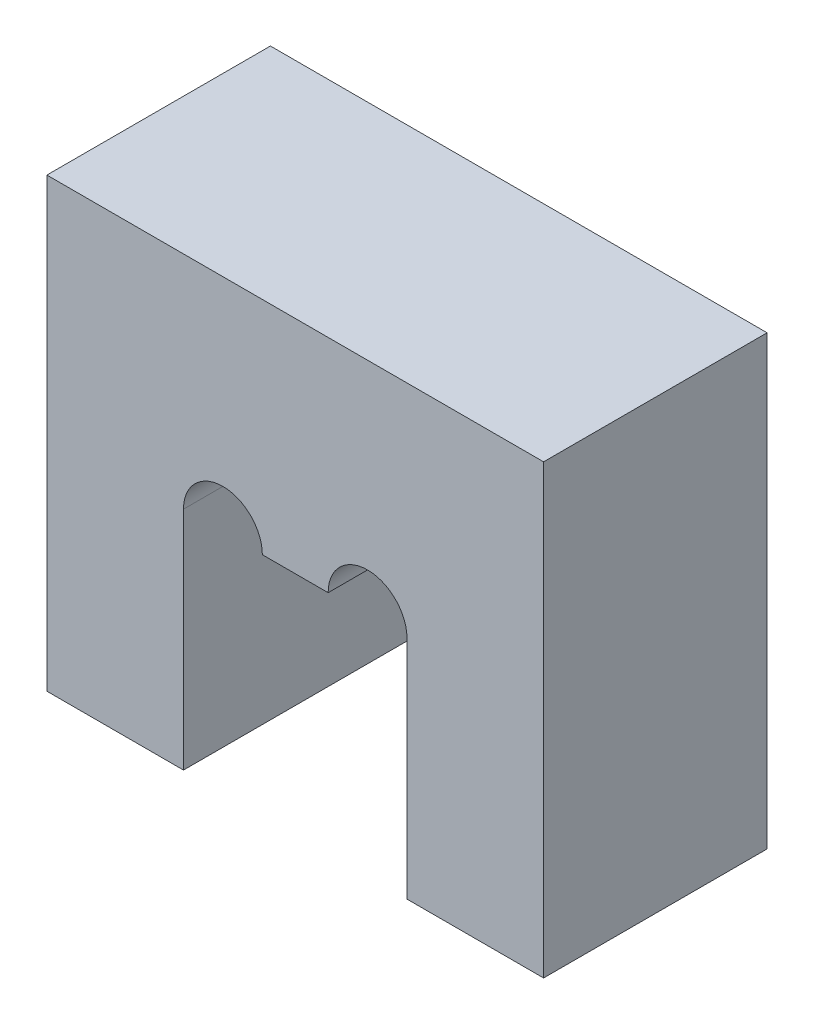
ISO-10303-21;
HEADER;
FILE_DESCRIPTION(('STEP AP214'),'2;1');
FILE_NAME('part.step','',(''),(''),'','','');
FILE_SCHEMA(('AUTOMOTIVE_DESIGN { 1 0 10303 214 1 1 1 1 }'));
ENDSEC;
DATA;
#1=APPLICATION_CONTEXT('core data for automotive mechanical design processes');
#2=APPLICATION_PROTOCOL_DEFINITION('international standard','automotive_design',2000,#1);
#3=PRODUCT_CONTEXT('',#1,'mechanical');
#4=PRODUCT('Part','Part','',(#3));
#5=PRODUCT_RELATED_PRODUCT_CATEGORY('part','',(#4));
#6=PRODUCT_DEFINITION_FORMATION('','',#4);
#7=PRODUCT_DEFINITION_CONTEXT('part definition',#1,'design');
#8=PRODUCT_DEFINITION('design','',#6,#7);
#9=PRODUCT_DEFINITION_SHAPE('','',#8);
#10=(LENGTH_UNIT() NAMED_UNIT(*) SI_UNIT(.MILLI.,.METRE.));
#11=(NAMED_UNIT(*) PLANE_ANGLE_UNIT() SI_UNIT($,.RADIAN.));
#12=(NAMED_UNIT(*) SI_UNIT($,.STERADIAN.) SOLID_ANGLE_UNIT());
#13=UNCERTAINTY_MEASURE_WITH_UNIT(LENGTH_MEASURE(1.E-05),#10,'distance_accuracy_value','');
#14=(GEOMETRIC_REPRESENTATION_CONTEXT(3) GLOBAL_UNCERTAINTY_ASSIGNED_CONTEXT((#13)) GLOBAL_UNIT_ASSIGNED_CONTEXT((#10,
#11,#12)) REPRESENTATION_CONTEXT('',''));
#15=CARTESIAN_POINT('',(0.,0.,0.));
#16=DIRECTION('',(0.,0.,1.));
#17=DIRECTION('',(1.,0.,0.));
#18=AXIS2_PLACEMENT_3D('',#15,#16,#17);
#19=CARTESIAN_POINT('',(11.4371755123007,16.1208791208791,18.));
#20=DIRECTION('',(-1.,0.,0.));
#21=DIRECTION('',(0.,-1.,0.));
#22=AXIS2_PLACEMENT_3D('',#19,#20,#21);
#23=PLANE('',#22);
#24=DIRECTION('',(0.,1.,0.));
#25=VECTOR('',#24,1.);
#26=CARTESIAN_POINT('',(11.4371755123007,16.1208791208791,0.));
#27=LINE('',#26,#25);
#28=CARTESIAN_POINT('',(11.4371755123007,-19.8791208791209,0.));
#29=VERTEX_POINT('',#28);
#30=CARTESIAN_POINT('',(11.4371755123007,16.1208791208791,0.));
#31=VERTEX_POINT('',#30);
#32=EDGE_CURVE('E141',#29,#31,#27,.T.);
#33=ORIENTED_EDGE('',*,*,#32,.T.);
#34=DIRECTION('',(0.,0.,-1.));
#35=VECTOR('',#34,1.);
#36=CARTESIAN_POINT('',(11.4371755123007,16.1208791208791,18.));
#37=LINE('',#36,#35);
#38=CARTESIAN_POINT('',(11.4371755123007,16.1208791208791,18.));
#39=VERTEX_POINT('',#38);
#40=EDGE_CURVE('E11',#39,#31,#37,.T.);
#41=ORIENTED_EDGE('',*,*,#40,.F.);
#42=DIRECTION('',(0.,1.,0.));
#43=VECTOR('',#42,1.);
#44=CARTESIAN_POINT('',(11.4371755123007,16.1208791208791,18.));
#45=LINE('',#44,#43);
#46=CARTESIAN_POINT('',(11.4371755123007,-19.8791208791209,18.));
#47=VERTEX_POINT('',#46);
#48=EDGE_CURVE('E159',#47,#39,#45,.T.);
#49=ORIENTED_EDGE('',*,*,#48,.F.);
#50=DIRECTION('',(0.,0.,-1.));
#51=VECTOR('',#50,1.);
#52=CARTESIAN_POINT('',(11.4371755123007,-19.8791208791209,18.));
#53=LINE('',#52,#51);
#54=EDGE_CURVE('E137',#47,#29,#53,.T.);
#55=ORIENTED_EDGE('',*,*,#54,.T.);
#56=EDGE_LOOP('',(#33,#41,#49,#55));
#57=FACE_BOUND('',#56,.T.);
#58=ADVANCED_FACE('F33',(#57),#23,.F.);
#59=CARTESIAN_POINT('',(-28.5628244876993,16.1208791208791,18.));
#60=DIRECTION('',(0.,-1.,0.));
#61=DIRECTION('',(0.,0.,-1.));
#62=AXIS2_PLACEMENT_3D('',#59,#60,#61);
#63=PLANE('',#62);
#64=DIRECTION('',(-1.,0.,0.));
#65=VECTOR('',#64,1.);
#66=CARTESIAN_POINT('',(-28.5628244876993,16.1208791208791,0.));
#67=LINE('',#66,#65);
#68=CARTESIAN_POINT('',(-28.5628244876993,16.1208791208791,0.));
#69=VERTEX_POINT('',#68);
#70=EDGE_CURVE('E144',#31,#69,#67,.T.);
#71=ORIENTED_EDGE('',*,*,#70,.T.);
#72=DIRECTION('',(0.,0.,-1.));
#73=VECTOR('',#72,1.);
#74=CARTESIAN_POINT('',(-28.5628244876993,16.1208791208791,18.));
#75=LINE('',#74,#73);
#76=CARTESIAN_POINT('',(-28.5628244876993,16.1208791208791,18.));
#77=VERTEX_POINT('',#76);
#78=EDGE_CURVE('E41',#77,#69,#75,.T.);
#79=ORIENTED_EDGE('',*,*,#78,.F.);
#80=DIRECTION('',(-1.,0.,0.));
#81=VECTOR('',#80,1.);
#82=CARTESIAN_POINT('',(-28.5628244876993,16.1208791208791,18.));
#83=LINE('',#82,#81);
#84=EDGE_CURVE('E98',#39,#77,#83,.T.);
#85=ORIENTED_EDGE('',*,*,#84,.F.);
#86=ORIENTED_EDGE('',*,*,#40,.T.);
#87=EDGE_LOOP('',(#71,#79,#85,#86));
#88=FACE_BOUND('',#87,.T.);
#89=ADVANCED_FACE('F208',(#88),#63,.F.);
#90=CARTESIAN_POINT('',(-28.5628244876993,16.1208791208791,18.));
#91=DIRECTION('',(1.,0.,0.));
#92=DIRECTION('',(0.,1.,0.));
#93=AXIS2_PLACEMENT_3D('',#90,#91,#92);
#94=PLANE('',#93);
#95=DIRECTION('',(0.,-1.,0.));
#96=VECTOR('',#95,1.);
#97=CARTESIAN_POINT('',(-28.5628244876993,16.1208791208791,0.));
#98=LINE('',#97,#96);
#99=CARTESIAN_POINT('',(-28.5628244876993,-19.8791208791209,0.));
#100=VERTEX_POINT('',#99);
#101=EDGE_CURVE('E146',#69,#100,#98,.T.);
#102=ORIENTED_EDGE('',*,*,#101,.T.);
#103=DIRECTION('',(0.,0.,-1.));
#104=VECTOR('',#103,1.);
#105=CARTESIAN_POINT('',(-28.5628244876993,-19.8791208791209,18.));
#106=LINE('',#105,#104);
#107=CARTESIAN_POINT('',(-28.5628244876993,-19.8791208791209,18.));
#108=VERTEX_POINT('',#107);
#109=EDGE_CURVE('E172',#108,#100,#106,.T.);
#110=ORIENTED_EDGE('',*,*,#109,.F.);
#111=DIRECTION('',(0.,-1.,0.));
#112=VECTOR('',#111,1.);
#113=CARTESIAN_POINT('',(-28.5628244876993,16.1208791208791,18.));
#114=LINE('',#113,#112);
#115=EDGE_CURVE('E180',#77,#108,#114,.T.);
#116=ORIENTED_EDGE('',*,*,#115,.F.);
#117=ORIENTED_EDGE('',*,*,#78,.T.);
#118=EDGE_LOOP('',(#102,#110,#116,#117));
#119=FACE_BOUND('',#118,.T.);
#120=ADVANCED_FACE('F178',(#119),#94,.F.);
#121=CARTESIAN_POINT('',(-28.5628244876993,-19.8791208791209,18.));
#122=DIRECTION('',(0.,1.,0.));
#123=DIRECTION('',(0.,0.,1.));
#124=AXIS2_PLACEMENT_3D('',#121,#122,#123);
#125=PLANE('',#124);
#126=DIRECTION('',(1.,0.,0.));
#127=VECTOR('',#126,1.);
#128=CARTESIAN_POINT('',(-28.5628244876993,-19.8791208791209,0.));
#129=LINE('',#128,#127);
#130=CARTESIAN_POINT('',(-17.5628244876993,-19.8791208791209,0.));
#131=VERTEX_POINT('',#130);
#132=EDGE_CURVE('E148',#100,#131,#129,.T.);
#133=ORIENTED_EDGE('',*,*,#132,.T.);
#134=DIRECTION('',(0.,0.,-1.));
#135=VECTOR('',#134,1.);
#136=CARTESIAN_POINT('',(-17.5628244876993,-19.8791208791209,18.));
#137=LINE('',#136,#135);
#138=CARTESIAN_POINT('',(-17.5628244876993,-19.8791208791209,18.));
#139=VERTEX_POINT('',#138);
#140=EDGE_CURVE('E169',#139,#131,#137,.T.);
#141=ORIENTED_EDGE('',*,*,#140,.F.);
#142=DIRECTION('',(1.,0.,0.));
#143=VECTOR('',#142,1.);
#144=CARTESIAN_POINT('',(-28.5628244876993,-19.8791208791209,18.));
#145=LINE('',#144,#143);
#146=EDGE_CURVE('E198',#108,#139,#145,.T.);
#147=ORIENTED_EDGE('',*,*,#146,.F.);
#148=ORIENTED_EDGE('',*,*,#109,.T.);
#149=EDGE_LOOP('',(#133,#141,#147,#148));
#150=FACE_BOUND('',#149,.T.);
#151=ADVANCED_FACE('F189',(#150),#125,.F.);
#152=CARTESIAN_POINT('',(-17.5628244876993,-1.68131868131868,18.));
#153=DIRECTION('',(-1.,0.,0.));
#154=DIRECTION('',(0.,0.,1.));
#155=AXIS2_PLACEMENT_3D('',#152,#153,#154);
#156=PLANE('',#155);
#157=DIRECTION('',(0.,1.,0.));
#158=VECTOR('',#157,1.);
#159=CARTESIAN_POINT('',(-17.5628244876993,-1.68131868131868,0.));
#160=LINE('',#159,#158);
#161=CARTESIAN_POINT('',(-17.5628244876993,-1.68131868131868,0.));
#162=VERTEX_POINT('',#161);
#163=EDGE_CURVE('E150',#131,#162,#160,.T.);
#164=ORIENTED_EDGE('',*,*,#163,.T.);
#165=DIRECTION('',(0.,0.,-1.));
#166=VECTOR('',#165,1.);
#167=CARTESIAN_POINT('',(-17.5628244876993,-1.68131868131868,18.));
#168=LINE('',#167,#166);
#169=CARTESIAN_POINT('',(-17.5628244876993,-1.68131868131868,18.));
#170=VERTEX_POINT('',#169);
#171=EDGE_CURVE('E166',#170,#162,#168,.T.);
#172=ORIENTED_EDGE('',*,*,#171,.F.);
#173=DIRECTION('',(0.,1.,0.));
#174=VECTOR('',#173,1.);
#175=CARTESIAN_POINT('',(-17.5628244876993,-1.68131868131868,18.));
#176=LINE('',#175,#174);
#177=EDGE_CURVE('E195',#139,#170,#176,.T.);
#178=ORIENTED_EDGE('',*,*,#177,.F.);
#179=ORIENTED_EDGE('',*,*,#140,.T.);
#180=EDGE_LOOP('',(#164,#172,#178,#179));
#181=FACE_BOUND('',#180,.T.);
#182=ADVANCED_FACE('F193',(#181),#156,.F.);
#183=CARTESIAN_POINT('',(-14.3878244876993,-1.68131868131868,18.));
#184=DIRECTION('',(0.,0.,-1.));
#185=DIRECTION('',(-1.,0.,0.));
#186=AXIS2_PLACEMENT_3D('',#183,#184,#185);
#187=CYLINDRICAL_SURFACE('',#186,3.175);
#188=CARTESIAN_POINT('',(-14.3878244876993,-1.68131868131868,0.));
#189=DIRECTION('',(0.,0.,-1.));
#190=DIRECTION('',(-1.,0.,0.));
#191=AXIS2_PLACEMENT_3D('',#188,#189,#190);
#192=CIRCLE('',#191,3.175);
#193=CARTESIAN_POINT('',(-11.2128244876993,-1.68131868131868,0.));
#194=VERTEX_POINT('',#193);
#195=EDGE_CURVE('E152',#162,#194,#192,.T.);
#196=ORIENTED_EDGE('',*,*,#195,.T.);
#197=DIRECTION('',(0.,0.,-1.));
#198=VECTOR('',#197,1.);
#199=CARTESIAN_POINT('',(-11.2128244876993,-1.68131868131868,18.));
#200=LINE('',#199,#198);
#201=CARTESIAN_POINT('',(-11.2128244876993,-1.68131868131868,18.));
#202=VERTEX_POINT('',#201);
#203=EDGE_CURVE('E163',#202,#194,#200,.T.);
#204=ORIENTED_EDGE('',*,*,#203,.F.);
#205=CARTESIAN_POINT('',(-14.3878244876993,-1.68131868131868,18.));
#206=DIRECTION('',(0.,0.,-1.));
#207=DIRECTION('',(-1.,0.,0.));
#208=AXIS2_PLACEMENT_3D('',#205,#206,#207);
#209=CIRCLE('',#208,3.175);
#210=EDGE_CURVE('E197',#170,#202,#209,.T.);
#211=ORIENTED_EDGE('',*,*,#210,.F.);
#212=ORIENTED_EDGE('',*,*,#171,.T.);
#213=EDGE_LOOP('',(#196,#204,#211,#212));
#214=FACE_BOUND('',#213,.T.);
#215=ADVANCED_FACE('F220',(#214),#187,.F.);
#216=CARTESIAN_POINT('',(-11.2128244876993,-1.68131868131868,18.));
#217=DIRECTION('',(0.,1.,0.));
#218=DIRECTION('',(-1.,0.,0.));
#219=AXIS2_PLACEMENT_3D('',#216,#217,#218);
#220=PLANE('',#219);
#221=DIRECTION('',(1.,0.,0.));
#222=VECTOR('',#221,1.);
#223=CARTESIAN_POINT('',(-11.2128244876993,-1.68131868131868,0.));
#224=LINE('',#223,#222);
#225=CARTESIAN_POINT('',(-5.91282448769928,-1.68131868131868,0.));
#226=VERTEX_POINT('',#225);
#227=EDGE_CURVE('E154',#194,#226,#224,.T.);
#228=ORIENTED_EDGE('',*,*,#227,.T.);
#229=DIRECTION('',(0.,0.,-1.));
#230=VECTOR('',#229,1.);
#231=CARTESIAN_POINT('',(-5.91282448769928,-1.68131868131868,18.));
#232=LINE('',#231,#230);
#233=CARTESIAN_POINT('',(-5.91282448769928,-1.68131868131868,18.));
#234=VERTEX_POINT('',#233);
#235=EDGE_CURVE('E132',#234,#226,#232,.T.);
#236=ORIENTED_EDGE('',*,*,#235,.F.);
#237=DIRECTION('',(1.,0.,0.));
#238=VECTOR('',#237,1.);
#239=CARTESIAN_POINT('',(-11.2128244876993,-1.68131868131868,18.));
#240=LINE('',#239,#238);
#241=EDGE_CURVE('E123',#202,#234,#240,.T.);
#242=ORIENTED_EDGE('',*,*,#241,.F.);
#243=ORIENTED_EDGE('',*,*,#203,.T.);
#244=EDGE_LOOP('',(#228,#236,#242,#243));
#245=FACE_BOUND('',#244,.T.);
#246=ADVANCED_FACE('F223',(#245),#220,.F.);
#247=CARTESIAN_POINT('',(-2.73782448769928,-1.68131868131868,18.));
#248=DIRECTION('',(0.,0.,-1.));
#249=DIRECTION('',(-1.,0.,0.));
#250=AXIS2_PLACEMENT_3D('',#247,#248,#249);
#251=CYLINDRICAL_SURFACE('',#250,3.175);
#252=CARTESIAN_POINT('',(-2.73782448769928,-1.68131868131868,0.));
#253=DIRECTION('',(0.,0.,-1.));
#254=DIRECTION('',(1.,0.,0.));
#255=AXIS2_PLACEMENT_3D('',#252,#253,#254);
#256=CIRCLE('',#255,3.175);
#257=CARTESIAN_POINT('',(0.437175512300724,-1.68131868131868,0.));
#258=VERTEX_POINT('',#257);
#259=EDGE_CURVE('E131',#226,#258,#256,.T.);
#260=ORIENTED_EDGE('',*,*,#259,.T.);
#261=DIRECTION('',(0.,0.,-1.));
#262=VECTOR('',#261,1.);
#263=CARTESIAN_POINT('',(0.437175512300724,-1.68131868131868,18.));
#264=LINE('',#263,#262);
#265=CARTESIAN_POINT('',(0.437175512300724,-1.68131868131868,18.));
#266=VERTEX_POINT('',#265);
#267=EDGE_CURVE('E128',#266,#258,#264,.T.);
#268=ORIENTED_EDGE('',*,*,#267,.F.);
#269=CARTESIAN_POINT('',(-2.73782448769928,-1.68131868131868,18.));
#270=DIRECTION('',(0.,0.,-1.));
#271=DIRECTION('',(1.,0.,0.));
#272=AXIS2_PLACEMENT_3D('',#269,#270,#271);
#273=CIRCLE('',#272,3.175);
#274=EDGE_CURVE('E117',#234,#266,#273,.T.);
#275=ORIENTED_EDGE('',*,*,#274,.F.);
#276=ORIENTED_EDGE('',*,*,#235,.T.);
#277=EDGE_LOOP('',(#260,#268,#275,#276));
#278=FACE_BOUND('',#277,.T.);
#279=ADVANCED_FACE('F129',(#278),#251,.F.);
#280=CARTESIAN_POINT('',(0.437175512300724,-1.68131868131868,18.));
#281=DIRECTION('',(1.,0.,0.));
#282=DIRECTION('',(0.,1.,0.));
#283=AXIS2_PLACEMENT_3D('',#280,#281,#282);
#284=PLANE('',#283);
#285=DIRECTION('',(0.,-1.,0.));
#286=VECTOR('',#285,1.);
#287=CARTESIAN_POINT('',(0.437175512300724,-1.68131868131868,0.));
#288=LINE('',#287,#286);
#289=CARTESIAN_POINT('',(0.437175512300728,-19.8791208791209,0.));
#290=VERTEX_POINT('',#289);
#291=EDGE_CURVE('E84',#258,#290,#288,.T.);
#292=ORIENTED_EDGE('',*,*,#291,.T.);
#293=DIRECTION('',(0.,0.,-1.));
#294=VECTOR('',#293,1.);
#295=CARTESIAN_POINT('',(0.437175512300728,-19.8791208791209,18.));
#296=LINE('',#295,#294);
#297=CARTESIAN_POINT('',(0.437175512300728,-19.8791208791209,18.));
#298=VERTEX_POINT('',#297);
#299=EDGE_CURVE('E133',#298,#290,#296,.T.);
#300=ORIENTED_EDGE('',*,*,#299,.F.);
#301=DIRECTION('',(0.,-1.,0.));
#302=VECTOR('',#301,1.);
#303=CARTESIAN_POINT('',(0.437175512300724,-1.68131868131868,18.));
#304=LINE('',#303,#302);
#305=EDGE_CURVE('E121',#266,#298,#304,.T.);
#306=ORIENTED_EDGE('',*,*,#305,.F.);
#307=ORIENTED_EDGE('',*,*,#267,.T.);
#308=EDGE_LOOP('',(#292,#300,#306,#307));
#309=FACE_BOUND('',#308,.T.);
#310=ADVANCED_FACE('F135',(#309),#284,.F.);
#311=CARTESIAN_POINT('',(0.437175512300728,-19.8791208791209,18.));
#312=DIRECTION('',(0.,1.,0.));
#313=DIRECTION('',(0.,0.,1.));
#314=AXIS2_PLACEMENT_3D('',#311,#312,#313);
#315=PLANE('',#314);
#316=DIRECTION('',(1.,0.,0.));
#317=VECTOR('',#316,1.);
#318=CARTESIAN_POINT('',(0.437175512300728,-19.8791208791209,0.));
#319=LINE('',#318,#317);
#320=EDGE_CURVE('E90',#290,#29,#319,.T.);
#321=ORIENTED_EDGE('',*,*,#320,.T.);
#322=ORIENTED_EDGE('',*,*,#54,.F.);
#323=DIRECTION('',(1.,0.,0.));
#324=VECTOR('',#323,1.);
#325=CARTESIAN_POINT('',(0.437175512300728,-19.8791208791209,18.));
#326=LINE('',#325,#324);
#327=EDGE_CURVE('E49',#298,#47,#326,.T.);
#328=ORIENTED_EDGE('',*,*,#327,.F.);
#329=ORIENTED_EDGE('',*,*,#299,.T.);
#330=EDGE_LOOP('',(#321,#322,#328,#329));
#331=FACE_BOUND('',#330,.T.);
#332=ADVANCED_FACE('F232',(#331),#315,.F.);
#333=CARTESIAN_POINT('',(-2.73782448769928,-1.68131868131868,18.));
#334=DIRECTION('',(0.,0.,1.));
#335=DIRECTION('',(1.,0.,0.));
#336=AXIS2_PLACEMENT_3D('',#333,#334,#335);
#337=PLANE('',#336);
#338=ORIENTED_EDGE('',*,*,#48,.T.);
#339=ORIENTED_EDGE('',*,*,#84,.T.);
#340=ORIENTED_EDGE('',*,*,#115,.T.);
#341=ORIENTED_EDGE('',*,*,#146,.T.);
#342=ORIENTED_EDGE('',*,*,#177,.T.);
#343=ORIENTED_EDGE('',*,*,#210,.T.);
#344=ORIENTED_EDGE('',*,*,#241,.T.);
#345=ORIENTED_EDGE('',*,*,#274,.T.);
#346=ORIENTED_EDGE('',*,*,#305,.T.);
#347=ORIENTED_EDGE('',*,*,#327,.T.);
#348=EDGE_LOOP('',(#338,#339,#340,#341,#342,#343,#344,#345,#346,#347));
#349=FACE_BOUND('',#348,.T.);
#350=ADVANCED_FACE('F119',(#349),#337,.T.);
#351=CARTESIAN_POINT('',(-2.73782448769928,-1.68131868131868,0.));
#352=DIRECTION('',(0.,0.,1.));
#353=DIRECTION('',(1.,0.,0.));
#354=AXIS2_PLACEMENT_3D('',#351,#352,#353);
#355=PLANE('',#354);
#356=ORIENTED_EDGE('',*,*,#32,.F.);
#357=ORIENTED_EDGE('',*,*,#320,.F.);
#358=ORIENTED_EDGE('',*,*,#291,.F.);
#359=ORIENTED_EDGE('',*,*,#259,.F.);
#360=ORIENTED_EDGE('',*,*,#227,.F.);
#361=ORIENTED_EDGE('',*,*,#195,.F.);
#362=ORIENTED_EDGE('',*,*,#163,.F.);
#363=ORIENTED_EDGE('',*,*,#132,.F.);
#364=ORIENTED_EDGE('',*,*,#101,.F.);
#365=ORIENTED_EDGE('',*,*,#70,.F.);
#366=EDGE_LOOP('',(#356,#357,#358,#359,#360,#361,#362,#363,#364,#365));
#367=FACE_BOUND('',#366,.T.);
#368=ADVANCED_FACE('F184',(#367),#355,.F.);
#369=CLOSED_SHELL('',(#58,#89,#120,#151,#182,#215,#246,#279,#310,#332,#350,#368));
#370=MANIFOLD_SOLID_BREP('B2',#369);
#371=ADVANCED_BREP_SHAPE_REPRESENTATION('',(#18,#370),#14);
#372=SHAPE_DEFINITION_REPRESENTATION(#9,#371);
ENDSEC;
END-ISO-10303-21;
